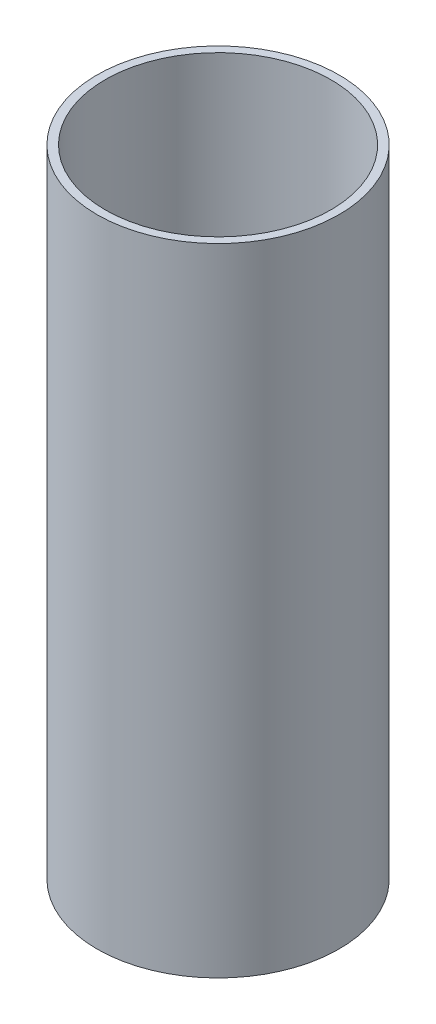
ISO-10303-21;
HEADER;
FILE_DESCRIPTION(('STEP AP214'),'2;1');
FILE_NAME('part.step','',(''),(''),'','','');
FILE_SCHEMA(('AUTOMOTIVE_DESIGN { 1 0 10303 214 1 1 1 1 }'));
ENDSEC;
DATA;
#1=APPLICATION_CONTEXT('core data for automotive mechanical design processes');
#2=APPLICATION_PROTOCOL_DEFINITION('international standard','automotive_design',2000,#1);
#3=PRODUCT_CONTEXT('',#1,'mechanical');
#4=PRODUCT('Part','Part','',(#3));
#5=PRODUCT_RELATED_PRODUCT_CATEGORY('part','',(#4));
#6=PRODUCT_DEFINITION_FORMATION('','',#4);
#7=PRODUCT_DEFINITION_CONTEXT('part definition',#1,'design');
#8=PRODUCT_DEFINITION('design','',#6,#7);
#9=PRODUCT_DEFINITION_SHAPE('','',#8);
#10=(LENGTH_UNIT() NAMED_UNIT(*) SI_UNIT(.MILLI.,.METRE.));
#11=(NAMED_UNIT(*) PLANE_ANGLE_UNIT() SI_UNIT($,.RADIAN.));
#12=(NAMED_UNIT(*) SI_UNIT($,.STERADIAN.) SOLID_ANGLE_UNIT());
#13=UNCERTAINTY_MEASURE_WITH_UNIT(LENGTH_MEASURE(1.E-05),#10,'distance_accuracy_value','');
#14=(GEOMETRIC_REPRESENTATION_CONTEXT(3) GLOBAL_UNCERTAINTY_ASSIGNED_CONTEXT((#13)) GLOBAL_UNIT_ASSIGNED_CONTEXT((#10,
#11,#12)) REPRESENTATION_CONTEXT('',''));
#15=CARTESIAN_POINT('',(0.,0.,0.));
#16=DIRECTION('',(0.,0.,1.));
#17=DIRECTION('',(1.,0.,0.));
#18=AXIS2_PLACEMENT_3D('',#15,#16,#17);
#19=CARTESIAN_POINT('',(0.,198.12,0.));
#20=DIRECTION('',(0.,1.,0.));
#21=DIRECTION('',(0.,0.,1.));
#22=AXIS2_PLACEMENT_3D('',#19,#20,#21);
#23=PLANE('',#22);
#24=CARTESIAN_POINT('',(0.,198.12,0.));
#25=DIRECTION('',(0.,1.,0.));
#26=DIRECTION('',(0.,0.,1.));
#27=AXIS2_PLACEMENT_3D('',#24,#25,#26);
#28=CIRCLE('',#27,37.7);
#29=CARTESIAN_POINT('',(0.,198.12,37.7));
#30=VERTEX_POINT('',#29);
#31=EDGE_CURVE('E10',#30,#30,#28,.T.);
#32=ORIENTED_EDGE('',*,*,#31,.T.);
#33=EDGE_LOOP('',(#32));
#34=FACE_BOUND('',#33,.T.);
#35=CARTESIAN_POINT('',(0.,198.12,0.));
#36=DIRECTION('',(0.,1.,0.));
#37=DIRECTION('',(0.,0.,1.));
#38=AXIS2_PLACEMENT_3D('',#35,#36,#37);
#39=CIRCLE('',#38,35.15);
#40=CARTESIAN_POINT('',(0.,198.12,35.15));
#41=VERTEX_POINT('',#40);
#42=EDGE_CURVE('E62',#41,#41,#39,.T.);
#43=ORIENTED_EDGE('',*,*,#42,.F.);
#44=EDGE_LOOP('',(#43));
#45=FACE_BOUND('',#44,.T.);
#46=ADVANCED_FACE('F49',(#34,#45),#23,.T.);
#47=CARTESIAN_POINT('',(0.,0.,0.));
#48=DIRECTION('',(0.,1.,0.));
#49=DIRECTION('',(0.,0.,1.));
#50=AXIS2_PLACEMENT_3D('',#47,#48,#49);
#51=PLANE('',#50);
#52=CARTESIAN_POINT('',(0.,0.,0.));
#53=DIRECTION('',(0.,1.,0.));
#54=DIRECTION('',(0.,0.,1.));
#55=AXIS2_PLACEMENT_3D('',#52,#53,#54);
#56=CIRCLE('',#55,37.7);
#57=CARTESIAN_POINT('',(0.,0.,37.7));
#58=VERTEX_POINT('',#57);
#59=EDGE_CURVE('E53',#58,#58,#56,.T.);
#60=ORIENTED_EDGE('',*,*,#59,.F.);
#61=EDGE_LOOP('',(#60));
#62=FACE_BOUND('',#61,.T.);
#63=CARTESIAN_POINT('',(0.,0.,0.));
#64=DIRECTION('',(0.,1.,0.));
#65=DIRECTION('',(0.,0.,1.));
#66=AXIS2_PLACEMENT_3D('',#63,#64,#65);
#67=CIRCLE('',#66,35.15);
#68=CARTESIAN_POINT('',(0.,0.,35.15));
#69=VERTEX_POINT('',#68);
#70=EDGE_CURVE('E64',#69,#69,#67,.T.);
#71=ORIENTED_EDGE('',*,*,#70,.T.);
#72=EDGE_LOOP('',(#71));
#73=FACE_BOUND('',#72,.T.);
#74=ADVANCED_FACE('F76',(#62,#73),#51,.F.);
#75=CARTESIAN_POINT('',(0.,198.12,0.));
#76=DIRECTION('',(0.,-1.,0.));
#77=DIRECTION('',(0.,0.,-1.));
#78=AXIS2_PLACEMENT_3D('',#75,#76,#77);
#79=CYLINDRICAL_SURFACE('',#78,37.7);
#80=ORIENTED_EDGE('',*,*,#31,.F.);
#81=EDGE_LOOP('',(#80));
#82=FACE_BOUND('',#81,.T.);
#83=ORIENTED_EDGE('',*,*,#59,.T.);
#84=EDGE_LOOP('',(#83));
#85=FACE_BOUND('',#84,.T.);
#86=ADVANCED_FACE('F51',(#82,#85),#79,.T.);
#87=CARTESIAN_POINT('',(0.,198.12,0.));
#88=DIRECTION('',(0.,-1.,0.));
#89=DIRECTION('',(0.,0.,-1.));
#90=AXIS2_PLACEMENT_3D('',#87,#88,#89);
#91=CYLINDRICAL_SURFACE('',#90,35.15);
#92=ORIENTED_EDGE('',*,*,#42,.T.);
#93=EDGE_LOOP('',(#92));
#94=FACE_BOUND('',#93,.T.);
#95=ORIENTED_EDGE('',*,*,#70,.F.);
#96=EDGE_LOOP('',(#95));
#97=FACE_BOUND('',#96,.T.);
#98=ADVANCED_FACE('F72',(#94,#97),#91,.F.);
#99=CLOSED_SHELL('',(#46,#74,#86,#98));
#100=MANIFOLD_SOLID_BREP('B2',#99);
#101=ADVANCED_BREP_SHAPE_REPRESENTATION('',(#18,#100),#14);
#102=SHAPE_DEFINITION_REPRESENTATION(#9,#101);
ENDSEC;
END-ISO-10303-21;
